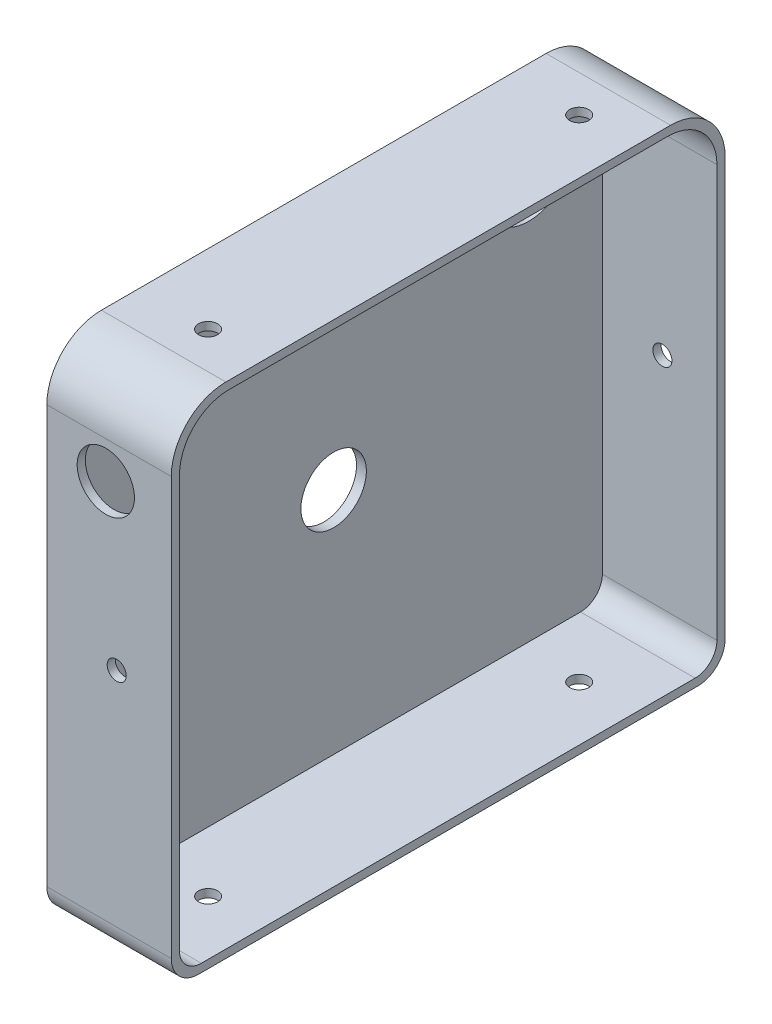
ISO-10303-21;
HEADER;
FILE_DESCRIPTION(('STEP AP214'),'2;1');
FILE_NAME('part.step','',(''),(''),'','','');
FILE_SCHEMA(('AUTOMOTIVE_DESIGN { 1 0 10303 214 1 1 1 1 }'));
ENDSEC;
DATA;
#1=APPLICATION_CONTEXT('core data for automotive mechanical design processes');
#2=APPLICATION_PROTOCOL_DEFINITION('international standard','automotive_design',2000,#1);
#3=PRODUCT_CONTEXT('',#1,'mechanical');
#4=PRODUCT('Part','Part','',(#3));
#5=PRODUCT_RELATED_PRODUCT_CATEGORY('part','',(#4));
#6=PRODUCT_DEFINITION_FORMATION('','',#4);
#7=PRODUCT_DEFINITION_CONTEXT('part definition',#1,'design');
#8=PRODUCT_DEFINITION('design','',#6,#7);
#9=PRODUCT_DEFINITION_SHAPE('','',#8);
#10=(LENGTH_UNIT() NAMED_UNIT(*) SI_UNIT(.MILLI.,.METRE.));
#11=(NAMED_UNIT(*) PLANE_ANGLE_UNIT() SI_UNIT($,.RADIAN.));
#12=(NAMED_UNIT(*) SI_UNIT($,.STERADIAN.) SOLID_ANGLE_UNIT());
#13=UNCERTAINTY_MEASURE_WITH_UNIT(LENGTH_MEASURE(1.E-05),#10,'distance_accuracy_value','');
#14=(GEOMETRIC_REPRESENTATION_CONTEXT(3) GLOBAL_UNCERTAINTY_ASSIGNED_CONTEXT((#13)) GLOBAL_UNIT_ASSIGNED_CONTEXT((#10,
#11,#12)) REPRESENTATION_CONTEXT('',''));
#15=CARTESIAN_POINT('',(0.,0.,0.));
#16=DIRECTION('',(0.,0.,1.));
#17=DIRECTION('',(1.,0.,0.));
#18=AXIS2_PLACEMENT_3D('',#15,#16,#17);
#19=CARTESIAN_POINT('',(-1.8,0.,0.));
#20=DIRECTION('',(-1.,0.,0.));
#21=DIRECTION('',(0.,0.,1.));
#22=AXIS2_PLACEMENT_3D('',#19,#20,#21);
#23=PLANE('',#22);
#24=CARTESIAN_POINT('',(-1.8,43.5,-50.75));
#25=DIRECTION('',(-1.,0.,0.));
#26=DIRECTION('',(0.,0.,1.));
#27=AXIS2_PLACEMENT_3D('',#24,#25,#26);
#28=CIRCLE('',#27,5.99999999999999);
#29=CARTESIAN_POINT('',(-1.8,43.5,-44.75));
#30=VERTEX_POINT('',#29);
#31=EDGE_CURVE('E230',#30,#30,#28,.T.);
#32=ORIENTED_EDGE('',*,*,#31,.F.);
#33=EDGE_LOOP('',(#32));
#34=FACE_BOUND('',#33,.T.);
#35=DIRECTION('',(0.,-1.,0.));
#36=VECTOR('',#35,1.);
#37=CARTESIAN_POINT('',(-1.8,91.5,-101.5));
#38=LINE('',#37,#36);
#39=CARTESIAN_POINT('',(-1.8,81.5,-101.5));
#40=VERTEX_POINT('',#39);
#41=CARTESIAN_POINT('',(-1.8,5.,-101.5));
#42=VERTEX_POINT('',#41);
#43=EDGE_CURVE('E239',#40,#42,#38,.T.);
#44=ORIENTED_EDGE('',*,*,#43,.T.);
#45=CARTESIAN_POINT('',(-1.8,5.,-96.5));
#46=DIRECTION('',(-1.,0.,0.));
#47=DIRECTION('',(0.,0.,1.));
#48=AXIS2_PLACEMENT_3D('',#45,#46,#47);
#49=CIRCLE('',#48,5.);
#50=CARTESIAN_POINT('',(-1.8,0.,-96.5));
#51=VERTEX_POINT('',#50);
#52=EDGE_CURVE('E351',#42,#51,#49,.T.);
#53=ORIENTED_EDGE('',*,*,#52,.T.);
#54=DIRECTION('',(0.,0.,1.));
#55=VECTOR('',#54,1.);
#56=CARTESIAN_POINT('',(-1.8,0.,-101.5));
#57=LINE('',#56,#55);
#58=CARTESIAN_POINT('',(-1.8,0.,-5.));
#59=VERTEX_POINT('',#58);
#60=EDGE_CURVE('E244',#51,#59,#57,.T.);
#61=ORIENTED_EDGE('',*,*,#60,.T.);
#62=CARTESIAN_POINT('',(-1.8,5.,-5.));
#63=DIRECTION('',(-1.,0.,0.));
#64=DIRECTION('',(0.,0.,1.));
#65=AXIS2_PLACEMENT_3D('',#62,#63,#64);
#66=CIRCLE('',#65,5.);
#67=CARTESIAN_POINT('',(-1.8,5.,0.));
#68=VERTEX_POINT('',#67);
#69=EDGE_CURVE('E349',#59,#68,#66,.T.);
#70=ORIENTED_EDGE('',*,*,#69,.T.);
#71=DIRECTION('',(0.,1.,0.));
#72=VECTOR('',#71,1.);
#73=CARTESIAN_POINT('',(-1.8,91.5,0.));
#74=LINE('',#73,#72);
#75=CARTESIAN_POINT('',(-1.8,81.5,0.));
#76=VERTEX_POINT('',#75);
#77=EDGE_CURVE('E247',#68,#76,#74,.T.);
#78=ORIENTED_EDGE('',*,*,#77,.T.);
#79=CARTESIAN_POINT('',(-1.8,81.5,-10.));
#80=DIRECTION('',(-1.,0.,0.));
#81=DIRECTION('',(0.,0.,1.));
#82=AXIS2_PLACEMENT_3D('',#79,#80,#81);
#83=CIRCLE('',#82,10.);
#84=CARTESIAN_POINT('',(-1.8,91.5,-10.));
#85=VERTEX_POINT('',#84);
#86=EDGE_CURVE('E314',#76,#85,#83,.T.);
#87=ORIENTED_EDGE('',*,*,#86,.T.);
#88=DIRECTION('',(0.,0.,-1.));
#89=VECTOR('',#88,1.);
#90=CARTESIAN_POINT('',(-1.8,91.5,-101.5));
#91=LINE('',#90,#89);
#92=CARTESIAN_POINT('',(-1.8,91.5,-91.5));
#93=VERTEX_POINT('',#92);
#94=EDGE_CURVE('E249',#85,#93,#91,.T.);
#95=ORIENTED_EDGE('',*,*,#94,.T.);
#96=CARTESIAN_POINT('',(-1.8,81.5,-91.5));
#97=DIRECTION('',(-1.,0.,0.));
#98=DIRECTION('',(0.,0.,1.));
#99=AXIS2_PLACEMENT_3D('',#96,#97,#98);
#100=CIRCLE('',#99,10.);
#101=EDGE_CURVE('E316',#93,#40,#100,.T.);
#102=ORIENTED_EDGE('',*,*,#101,.T.);
#103=EDGE_LOOP('',(#44,#53,#61,#70,#78,#87,#95,#102));
#104=FACE_BOUND('',#103,.T.);
#105=CARTESIAN_POINT('',(-1.8,76.5,-86.5));
#106=DIRECTION('',(-1.,0.,0.));
#107=DIRECTION('',(0.,0.,1.));
#108=AXIS2_PLACEMENT_3D('',#105,#106,#107);
#109=CIRCLE('',#108,8.24999999999999);
#110=CARTESIAN_POINT('',(-1.8,76.5,-78.25));
#111=VERTEX_POINT('',#110);
#112=EDGE_CURVE('E236',#111,#111,#109,.T.);
#113=ORIENTED_EDGE('',*,*,#112,.F.);
#114=EDGE_LOOP('',(#113));
#115=FACE_BOUND('',#114,.T.);
#116=CARTESIAN_POINT('',(-1.8,43.5,-45.75));
#117=DIRECTION('',(-1.,0.,0.));
#118=DIRECTION('',(0.,0.,1.));
#119=AXIS2_PLACEMENT_3D('',#116,#117,#118);
#120=CIRCLE('',#119,25.);
#121=CARTESIAN_POINT('',(-1.8,43.5,-20.75));
#122=VERTEX_POINT('',#121);
#123=CARTESIAN_POINT('',(-1.8,43.5,-70.75));
#124=VERTEX_POINT('',#123);
#125=EDGE_CURVE('E50',#122,#124,#120,.T.);
#126=ORIENTED_EDGE('',*,*,#125,.F.);
#127=DIRECTION('',(0.,0.,1.));
#128=VECTOR('',#127,1.);
#129=CARTESIAN_POINT('',(-1.8,43.5,-30.75));
#130=LINE('',#129,#128);
#131=CARTESIAN_POINT('',(-1.8,43.5,-30.75));
#132=VERTEX_POINT('',#131);
#133=EDGE_CURVE('E183',#132,#122,#130,.T.);
#134=ORIENTED_EDGE('',*,*,#133,.F.);
#135=CARTESIAN_POINT('',(-1.8,43.5,-50.75));
#136=DIRECTION('',(1.,0.,0.));
#137=DIRECTION('',(0.,0.,1.));
#138=AXIS2_PLACEMENT_3D('',#135,#136,#137);
#139=CIRCLE('',#138,20.);
#140=EDGE_CURVE('E186',#124,#132,#139,.T.);
#141=ORIENTED_EDGE('',*,*,#140,.F.);
#142=EDGE_LOOP('',(#126,#134,#141));
#143=FACE_BOUND('',#142,.T.);
#144=ADVANCED_FACE('F35',(#34,#104,#115,#143),#23,.T.);
#145=CARTESIAN_POINT('',(21.,0.,0.));
#146=DIRECTION('',(-1.,0.,0.));
#147=DIRECTION('',(0.,0.,1.));
#148=AXIS2_PLACEMENT_3D('',#145,#146,#147);
#149=PLANE('',#148);
#150=DIRECTION('',(0.,0.,-1.));
#151=VECTOR('',#150,1.);
#152=CARTESIAN_POINT('',(21.,0.,0.));
#153=LINE('',#152,#151);
#154=CARTESIAN_POINT('',(21.,0.,-5.));
#155=VERTEX_POINT('',#154);
#156=CARTESIAN_POINT('',(21.,0.,-96.5));
#157=VERTEX_POINT('',#156);
#158=EDGE_CURVE('E276',#155,#157,#153,.T.);
#159=ORIENTED_EDGE('',*,*,#158,.T.);
#160=CARTESIAN_POINT('',(21.,5.,-96.5));
#161=DIRECTION('',(-1.,0.,0.));
#162=DIRECTION('',(0.,0.,1.));
#163=AXIS2_PLACEMENT_3D('',#160,#161,#162);
#164=CIRCLE('',#163,5.);
#165=CARTESIAN_POINT('',(21.,5.,-101.5));
#166=VERTEX_POINT('',#165);
#167=EDGE_CURVE('E43',#157,#166,#164,.F.);
#168=ORIENTED_EDGE('',*,*,#167,.T.);
#169=DIRECTION('',(0.,1.,0.));
#170=VECTOR('',#169,1.);
#171=CARTESIAN_POINT('',(21.,0.,-101.5));
#172=LINE('',#171,#170);
#173=CARTESIAN_POINT('',(21.,81.5,-101.5));
#174=VERTEX_POINT('',#173);
#175=EDGE_CURVE('E279',#166,#174,#172,.T.);
#176=ORIENTED_EDGE('',*,*,#175,.T.);
#177=CARTESIAN_POINT('',(21.,81.5,-91.5));
#178=DIRECTION('',(-1.,0.,0.));
#179=DIRECTION('',(0.,0.,1.));
#180=AXIS2_PLACEMENT_3D('',#177,#178,#179);
#181=CIRCLE('',#180,10.);
#182=CARTESIAN_POINT('',(21.,91.5,-91.5));
#183=VERTEX_POINT('',#182);
#184=EDGE_CURVE('E323',#174,#183,#181,.F.);
#185=ORIENTED_EDGE('',*,*,#184,.T.);
#186=DIRECTION('',(0.,0.,1.));
#187=VECTOR('',#186,1.);
#188=CARTESIAN_POINT('',(21.,91.5,0.));
#189=LINE('',#188,#187);
#190=CARTESIAN_POINT('',(21.,91.5,-9.99999999999999));
#191=VERTEX_POINT('',#190);
#192=EDGE_CURVE('E281',#183,#191,#189,.T.);
#193=ORIENTED_EDGE('',*,*,#192,.T.);
#194=CARTESIAN_POINT('',(21.,81.5,-10.));
#195=DIRECTION('',(-1.,0.,0.));
#196=DIRECTION('',(0.,0.,1.));
#197=AXIS2_PLACEMENT_3D('',#194,#195,#196);
#198=CIRCLE('',#197,10.);
#199=CARTESIAN_POINT('',(21.,81.5,0.));
#200=VERTEX_POINT('',#199);
#201=EDGE_CURVE('E321',#191,#200,#198,.F.);
#202=ORIENTED_EDGE('',*,*,#201,.T.);
#203=DIRECTION('',(0.,-1.,0.));
#204=VECTOR('',#203,1.);
#205=CARTESIAN_POINT('',(21.,0.,0.));
#206=LINE('',#205,#204);
#207=CARTESIAN_POINT('',(21.,5.,0.));
#208=VERTEX_POINT('',#207);
#209=EDGE_CURVE('E265',#200,#208,#206,.T.);
#210=ORIENTED_EDGE('',*,*,#209,.T.);
#211=CARTESIAN_POINT('',(21.,5.,-5.));
#212=DIRECTION('',(-1.,0.,0.));
#213=DIRECTION('',(0.,0.,1.));
#214=AXIS2_PLACEMENT_3D('',#211,#212,#213);
#215=CIRCLE('',#214,5.);
#216=EDGE_CURVE('E358',#208,#155,#215,.F.);
#217=ORIENTED_EDGE('',*,*,#216,.T.);
#218=EDGE_LOOP('',(#159,#168,#176,#185,#193,#202,#210,#217));
#219=FACE_BOUND('',#218,.T.);
#220=DIRECTION('',(0.,0.,-1.));
#221=VECTOR('',#220,1.);
#222=CARTESIAN_POINT('',(21.,1.5,-1.5));
#223=LINE('',#222,#221);
#224=CARTESIAN_POINT('',(21.,1.5,-5.5));
#225=VERTEX_POINT('',#224);
#226=CARTESIAN_POINT('',(21.,1.5,-96.));
#227=VERTEX_POINT('',#226);
#228=EDGE_CURVE('E253',#225,#227,#223,.T.);
#229=ORIENTED_EDGE('',*,*,#228,.F.);
#230=CARTESIAN_POINT('',(21.,5.5,-5.5));
#231=DIRECTION('',(-1.,0.,0.));
#232=DIRECTION('',(0.,0.,1.));
#233=AXIS2_PLACEMENT_3D('',#230,#231,#232);
#234=CIRCLE('',#233,4.);
#235=CARTESIAN_POINT('',(21.,5.5,-1.5));
#236=VERTEX_POINT('',#235);
#237=EDGE_CURVE('E342',#225,#236,#234,.T.);
#238=ORIENTED_EDGE('',*,*,#237,.T.);
#239=DIRECTION('',(0.,-1.,0.));
#240=VECTOR('',#239,1.);
#241=CARTESIAN_POINT('',(21.,1.5,-1.5));
#242=LINE('',#241,#240);
#243=CARTESIAN_POINT('',(21.,81.,-1.5));
#244=VERTEX_POINT('',#243);
#245=EDGE_CURVE('E262',#244,#236,#242,.T.);
#246=ORIENTED_EDGE('',*,*,#245,.F.);
#247=CARTESIAN_POINT('',(21.,81.,-10.5));
#248=DIRECTION('',(-1.,0.,0.));
#249=DIRECTION('',(0.,0.,1.));
#250=AXIS2_PLACEMENT_3D('',#247,#248,#249);
#251=CIRCLE('',#250,9.);
#252=CARTESIAN_POINT('',(21.,90.,-10.5));
#253=VERTEX_POINT('',#252);
#254=EDGE_CURVE('E304',#244,#253,#251,.T.);
#255=ORIENTED_EDGE('',*,*,#254,.T.);
#256=DIRECTION('',(0.,0.,1.));
#257=VECTOR('',#256,1.);
#258=CARTESIAN_POINT('',(21.,90.,-1.5));
#259=LINE('',#258,#257);
#260=CARTESIAN_POINT('',(21.,90.,-91.));
#261=VERTEX_POINT('',#260);
#262=EDGE_CURVE('E259',#261,#253,#259,.T.);
#263=ORIENTED_EDGE('',*,*,#262,.F.);
#264=CARTESIAN_POINT('',(21.,81.,-91.));
#265=DIRECTION('',(-1.,0.,0.));
#266=DIRECTION('',(0.,0.,1.));
#267=AXIS2_PLACEMENT_3D('',#264,#265,#266);
#268=CIRCLE('',#267,9.);
#269=CARTESIAN_POINT('',(21.,81.,-100.));
#270=VERTEX_POINT('',#269);
#271=EDGE_CURVE('E306',#261,#270,#268,.T.);
#272=ORIENTED_EDGE('',*,*,#271,.T.);
#273=DIRECTION('',(0.,1.,0.));
#274=VECTOR('',#273,1.);
#275=CARTESIAN_POINT('',(21.,1.5,-100.));
#276=LINE('',#275,#274);
#277=CARTESIAN_POINT('',(21.,5.5,-100.));
#278=VERTEX_POINT('',#277);
#279=EDGE_CURVE('E256',#278,#270,#276,.T.);
#280=ORIENTED_EDGE('',*,*,#279,.F.);
#281=CARTESIAN_POINT('',(21.,5.5,-96.));
#282=DIRECTION('',(-1.,0.,0.));
#283=DIRECTION('',(0.,0.,1.));
#284=AXIS2_PLACEMENT_3D('',#281,#282,#283);
#285=CIRCLE('',#284,4.);
#286=EDGE_CURVE('E344',#278,#227,#285,.T.);
#287=ORIENTED_EDGE('',*,*,#286,.T.);
#288=EDGE_LOOP('',(#229,#238,#246,#255,#263,#272,#280,#287));
#289=FACE_BOUND('',#288,.T.);
#290=ADVANCED_FACE('F362',(#219,#289),#149,.F.);
#291=CARTESIAN_POINT('',(21.,0.,0.));
#292=DIRECTION('',(0.,0.,-1.));
#293=DIRECTION('',(-1.,0.,0.));
#294=AXIS2_PLACEMENT_3D('',#291,#292,#293);
#295=PLANE('',#294);
#296=CARTESIAN_POINT('',(9.,74.75,0.));
#297=DIRECTION('',(0.,0.,1.));
#298=DIRECTION('',(1.,0.,0.));
#299=AXIS2_PLACEMENT_3D('',#296,#297,#298);
#300=CIRCLE('',#299,5.25000000000001);
#301=CARTESIAN_POINT('',(14.25,74.75,0.));
#302=VERTEX_POINT('',#301);
#303=EDGE_CURVE('E194',#302,#302,#300,.T.);
#304=ORIENTED_EDGE('',*,*,#303,.F.);
#305=EDGE_LOOP('',(#304));
#306=FACE_BOUND('',#305,.T.);
#307=CARTESIAN_POINT('',(11.,45.75,0.));
#308=DIRECTION('',(0.,0.,1.));
#309=DIRECTION('',(1.,0.,0.));
#310=AXIS2_PLACEMENT_3D('',#307,#308,#309);
#311=CIRCLE('',#310,1.75);
#312=CARTESIAN_POINT('',(12.75,45.75,0.));
#313=VERTEX_POINT('',#312);
#314=EDGE_CURVE('E219',#313,#313,#311,.T.);
#315=ORIENTED_EDGE('',*,*,#314,.F.);
#316=EDGE_LOOP('',(#315));
#317=FACE_BOUND('',#316,.T.);
#318=ORIENTED_EDGE('',*,*,#77,.F.);
#319=DIRECTION('',(-1.,0.,0.));
#320=VECTOR('',#319,1.);
#321=CARTESIAN_POINT('',(21.,5.,0.));
#322=LINE('',#321,#320);
#323=EDGE_CURVE('E11',#68,#208,#322,.F.);
#324=ORIENTED_EDGE('',*,*,#323,.T.);
#325=ORIENTED_EDGE('',*,*,#209,.F.);
#326=DIRECTION('',(-1.,0.,0.));
#327=VECTOR('',#326,1.);
#328=CARTESIAN_POINT('',(21.,81.5,0.));
#329=LINE('',#328,#327);
#330=EDGE_CURVE('E325',#200,#76,#329,.T.);
#331=ORIENTED_EDGE('',*,*,#330,.T.);
#332=EDGE_LOOP('',(#318,#324,#325,#331));
#333=FACE_BOUND('',#332,.T.);
#334=ADVANCED_FACE('F383',(#306,#317,#333),#295,.F.);
#335=CARTESIAN_POINT('',(21.,0.,0.));
#336=DIRECTION('',(0.,1.,0.));
#337=DIRECTION('',(0.,0.,1.));
#338=AXIS2_PLACEMENT_3D('',#335,#336,#337);
#339=PLANE('',#338);
#340=CARTESIAN_POINT('',(11.,0.,-84.75));
#341=DIRECTION('',(0.,1.,0.));
#342=DIRECTION('',(0.,0.,-1.));
#343=AXIS2_PLACEMENT_3D('',#340,#341,#342);
#344=CIRCLE('',#343,1.75000000000001);
#345=CARTESIAN_POINT('',(11.,0.,-86.5));
#346=VERTEX_POINT('',#345);
#347=EDGE_CURVE('E200',#346,#346,#344,.T.);
#348=ORIENTED_EDGE('',*,*,#347,.T.);
#349=EDGE_LOOP('',(#348));
#350=FACE_BOUND('',#349,.T.);
#351=CARTESIAN_POINT('',(11.,0.,-16.75));
#352=DIRECTION('',(0.,1.,0.));
#353=DIRECTION('',(0.,0.,1.));
#354=AXIS2_PLACEMENT_3D('',#351,#352,#353);
#355=CIRCLE('',#354,1.75000000000001);
#356=CARTESIAN_POINT('',(11.,0.,-15.));
#357=VERTEX_POINT('',#356);
#358=EDGE_CURVE('E207',#357,#357,#355,.T.);
#359=ORIENTED_EDGE('',*,*,#358,.T.);
#360=EDGE_LOOP('',(#359));
#361=FACE_BOUND('',#360,.T.);
#362=ORIENTED_EDGE('',*,*,#60,.F.);
#363=DIRECTION('',(-1.,0.,0.));
#364=VECTOR('',#363,1.);
#365=CARTESIAN_POINT('',(21.,0.,-96.5));
#366=LINE('',#365,#364);
#367=EDGE_CURVE('E356',#51,#157,#366,.F.);
#368=ORIENTED_EDGE('',*,*,#367,.T.);
#369=ORIENTED_EDGE('',*,*,#158,.F.);
#370=DIRECTION('',(-1.,0.,0.));
#371=VECTOR('',#370,1.);
#372=CARTESIAN_POINT('',(21.,0.,-5.));
#373=LINE('',#372,#371);
#374=EDGE_CURVE('E353',#155,#59,#373,.T.);
#375=ORIENTED_EDGE('',*,*,#374,.T.);
#376=EDGE_LOOP('',(#362,#368,#369,#375));
#377=FACE_BOUND('',#376,.T.);
#378=ADVANCED_FACE('F378',(#350,#361,#377),#339,.F.);
#379=CARTESIAN_POINT('',(21.,0.,-101.5));
#380=DIRECTION('',(0.,0.,1.));
#381=DIRECTION('',(1.,0.,0.));
#382=AXIS2_PLACEMENT_3D('',#379,#380,#381);
#383=PLANE('',#382);
#384=CARTESIAN_POINT('',(11.,45.75,-101.5));
#385=DIRECTION('',(0.,0.,1.));
#386=DIRECTION('',(1.,0.,0.));
#387=AXIS2_PLACEMENT_3D('',#384,#385,#386);
#388=CIRCLE('',#387,1.75);
#389=CARTESIAN_POINT('',(12.75,45.75,-101.5));
#390=VERTEX_POINT('',#389);
#391=EDGE_CURVE('E220',#390,#390,#388,.T.);
#392=ORIENTED_EDGE('',*,*,#391,.T.);
#393=EDGE_LOOP('',(#392));
#394=FACE_BOUND('',#393,.T.);
#395=ORIENTED_EDGE('',*,*,#175,.F.);
#396=DIRECTION('',(-1.,0.,0.));
#397=VECTOR('',#396,1.);
#398=CARTESIAN_POINT('',(21.,5.,-101.5));
#399=LINE('',#398,#397);
#400=EDGE_CURVE('E346',#166,#42,#399,.T.);
#401=ORIENTED_EDGE('',*,*,#400,.T.);
#402=ORIENTED_EDGE('',*,*,#43,.F.);
#403=DIRECTION('',(-1.,0.,0.));
#404=VECTOR('',#403,1.);
#405=CARTESIAN_POINT('',(21.,81.5,-101.5));
#406=LINE('',#405,#404);
#407=EDGE_CURVE('E318',#40,#174,#406,.F.);
#408=ORIENTED_EDGE('',*,*,#407,.T.);
#409=EDGE_LOOP('',(#395,#401,#402,#408));
#410=FACE_BOUND('',#409,.T.);
#411=ADVANCED_FACE('F369',(#394,#410),#383,.F.);
#412=CARTESIAN_POINT('',(21.,91.5,0.));
#413=DIRECTION('',(0.,-1.,0.));
#414=DIRECTION('',(0.,0.,-1.));
#415=AXIS2_PLACEMENT_3D('',#412,#413,#414);
#416=PLANE('',#415);
#417=CARTESIAN_POINT('',(11.,91.5,-84.75));
#418=DIRECTION('',(0.,1.,0.));
#419=DIRECTION('',(0.,0.,-1.));
#420=AXIS2_PLACEMENT_3D('',#417,#418,#419);
#421=CIRCLE('',#420,1.75000000000001);
#422=CARTESIAN_POINT('',(11.,91.5,-86.5));
#423=VERTEX_POINT('',#422);
#424=EDGE_CURVE('E204',#423,#423,#421,.T.);
#425=ORIENTED_EDGE('',*,*,#424,.F.);
#426=EDGE_LOOP('',(#425));
#427=FACE_BOUND('',#426,.T.);
#428=CARTESIAN_POINT('',(11.,91.5,-16.75));
#429=DIRECTION('',(0.,1.,0.));
#430=DIRECTION('',(0.,0.,1.));
#431=AXIS2_PLACEMENT_3D('',#428,#429,#430);
#432=CIRCLE('',#431,1.75000000000001);
#433=CARTESIAN_POINT('',(11.,91.5,-15.));
#434=VERTEX_POINT('',#433);
#435=EDGE_CURVE('E198',#434,#434,#432,.T.);
#436=ORIENTED_EDGE('',*,*,#435,.F.);
#437=EDGE_LOOP('',(#436));
#438=FACE_BOUND('',#437,.T.);
#439=ORIENTED_EDGE('',*,*,#192,.F.);
#440=DIRECTION('',(-1.,0.,0.));
#441=VECTOR('',#440,1.);
#442=CARTESIAN_POINT('',(21.,91.5,-91.5));
#443=LINE('',#442,#441);
#444=EDGE_CURVE('E311',#183,#93,#443,.T.);
#445=ORIENTED_EDGE('',*,*,#444,.T.);
#446=ORIENTED_EDGE('',*,*,#94,.F.);
#447=DIRECTION('',(-1.,0.,0.));
#448=VECTOR('',#447,1.);
#449=CARTESIAN_POINT('',(21.,91.5,-10.));
#450=LINE('',#449,#448);
#451=EDGE_CURVE('E309',#85,#191,#450,.F.);
#452=ORIENTED_EDGE('',*,*,#451,.T.);
#453=EDGE_LOOP('',(#439,#445,#446,#452));
#454=FACE_BOUND('',#453,.T.);
#455=ADVANCED_FACE('F392',(#427,#438,#454),#416,.F.);
#456=CARTESIAN_POINT('',(21.,1.5,-1.5));
#457=DIRECTION('',(0.,1.,0.));
#458=DIRECTION('',(0.,0.,1.));
#459=AXIS2_PLACEMENT_3D('',#456,#457,#458);
#460=PLANE('',#459);
#461=CARTESIAN_POINT('',(11.,1.5,-84.75));
#462=DIRECTION('',(0.,1.,0.));
#463=DIRECTION('',(0.,0.,1.));
#464=AXIS2_PLACEMENT_3D('',#461,#462,#463);
#465=CIRCLE('',#464,1.75000000000001);
#466=CARTESIAN_POINT('',(11.,1.5,-83.));
#467=VERTEX_POINT('',#466);
#468=EDGE_CURVE('E216',#467,#467,#465,.T.);
#469=ORIENTED_EDGE('',*,*,#468,.F.);
#470=EDGE_LOOP('',(#469));
#471=FACE_BOUND('',#470,.T.);
#472=CARTESIAN_POINT('',(11.,1.5,-16.75));
#473=DIRECTION('',(0.,1.,0.));
#474=DIRECTION('',(0.,0.,1.));
#475=AXIS2_PLACEMENT_3D('',#472,#473,#474);
#476=CIRCLE('',#475,1.75000000000001);
#477=CARTESIAN_POINT('',(11.,1.5,-15.));
#478=VERTEX_POINT('',#477);
#479=EDGE_CURVE('E212',#478,#478,#476,.T.);
#480=ORIENTED_EDGE('',*,*,#479,.F.);
#481=EDGE_LOOP('',(#480));
#482=FACE_BOUND('',#481,.T.);
#483=DIRECTION('',(0.,0.,-1.));
#484=VECTOR('',#483,1.);
#485=CARTESIAN_POINT('',(0.,1.5,-1.5));
#486=LINE('',#485,#484);
#487=CARTESIAN_POINT('',(0.,1.5,-5.5));
#488=VERTEX_POINT('',#487);
#489=CARTESIAN_POINT('',(0.,1.5,-96.));
#490=VERTEX_POINT('',#489);
#491=EDGE_CURVE('E252',#488,#490,#486,.T.);
#492=ORIENTED_EDGE('',*,*,#491,.F.);
#493=DIRECTION('',(-1.,0.,0.));
#494=VECTOR('',#493,1.);
#495=CARTESIAN_POINT('',(21.,1.5,-5.5));
#496=LINE('',#495,#494);
#497=EDGE_CURVE('E338',#488,#225,#496,.F.);
#498=ORIENTED_EDGE('',*,*,#497,.T.);
#499=ORIENTED_EDGE('',*,*,#228,.T.);
#500=DIRECTION('',(-1.,0.,0.));
#501=VECTOR('',#500,1.);
#502=CARTESIAN_POINT('',(0.,1.5,-96.));
#503=LINE('',#502,#501);
#504=EDGE_CURVE('E335',#227,#490,#503,.T.);
#505=ORIENTED_EDGE('',*,*,#504,.T.);
#506=EDGE_LOOP('',(#492,#498,#499,#505));
#507=FACE_BOUND('',#506,.T.);
#508=ADVANCED_FACE('F435',(#471,#482,#507),#460,.T.);
#509=CARTESIAN_POINT('',(21.,1.5,-100.));
#510=DIRECTION('',(0.,0.,1.));
#511=DIRECTION('',(1.,0.,0.));
#512=AXIS2_PLACEMENT_3D('',#509,#510,#511);
#513=PLANE('',#512);
#514=CARTESIAN_POINT('',(11.,45.75,-100.));
#515=DIRECTION('',(0.,0.,1.));
#516=DIRECTION('',(1.,0.,0.));
#517=AXIS2_PLACEMENT_3D('',#514,#515,#516);
#518=CIRCLE('',#517,1.75);
#519=CARTESIAN_POINT('',(12.75,45.75,-100.));
#520=VERTEX_POINT('',#519);
#521=EDGE_CURVE('E226',#520,#520,#518,.T.);
#522=ORIENTED_EDGE('',*,*,#521,.F.);
#523=EDGE_LOOP('',(#522));
#524=FACE_BOUND('',#523,.T.);
#525=DIRECTION('',(0.,1.,0.));
#526=VECTOR('',#525,1.);
#527=CARTESIAN_POINT('',(0.,1.5,-100.));
#528=LINE('',#527,#526);
#529=CARTESIAN_POINT('',(0.,5.5,-100.));
#530=VERTEX_POINT('',#529);
#531=CARTESIAN_POINT('',(0.,81.,-100.));
#532=VERTEX_POINT('',#531);
#533=EDGE_CURVE('E268',#530,#532,#528,.T.);
#534=ORIENTED_EDGE('',*,*,#533,.F.);
#535=DIRECTION('',(-1.,0.,0.));
#536=VECTOR('',#535,1.);
#537=CARTESIAN_POINT('',(21.,5.5,-100.));
#538=LINE('',#537,#536);
#539=EDGE_CURVE('E340',#530,#278,#538,.F.);
#540=ORIENTED_EDGE('',*,*,#539,.T.);
#541=ORIENTED_EDGE('',*,*,#279,.T.);
#542=DIRECTION('',(-1.,0.,0.));
#543=VECTOR('',#542,1.);
#544=CARTESIAN_POINT('',(0.,81.,-100.));
#545=LINE('',#544,#543);
#546=EDGE_CURVE('E301',#270,#532,#545,.T.);
#547=ORIENTED_EDGE('',*,*,#546,.T.);
#548=EDGE_LOOP('',(#534,#540,#541,#547));
#549=FACE_BOUND('',#548,.T.);
#550=ADVANCED_FACE('F431',(#524,#549),#513,.T.);
#551=CARTESIAN_POINT('',(21.,90.,-1.5));
#552=DIRECTION('',(0.,-1.,0.));
#553=DIRECTION('',(0.,0.,-1.));
#554=AXIS2_PLACEMENT_3D('',#551,#552,#553);
#555=PLANE('',#554);
#556=CARTESIAN_POINT('',(11.,90.,-84.75));
#557=DIRECTION('',(0.,-1.,0.));
#558=DIRECTION('',(0.,0.,-1.));
#559=AXIS2_PLACEMENT_3D('',#556,#557,#558);
#560=CIRCLE('',#559,1.75000000000001);
#561=CARTESIAN_POINT('',(11.,90.,-86.5));
#562=VERTEX_POINT('',#561);
#563=EDGE_CURVE('E215',#562,#562,#560,.T.);
#564=ORIENTED_EDGE('',*,*,#563,.F.);
#565=EDGE_LOOP('',(#564));
#566=FACE_BOUND('',#565,.T.);
#567=CARTESIAN_POINT('',(11.,90.,-16.75));
#568=DIRECTION('',(0.,-1.,0.));
#569=DIRECTION('',(0.,0.,-1.));
#570=AXIS2_PLACEMENT_3D('',#567,#568,#569);
#571=CIRCLE('',#570,1.75000000000001);
#572=CARTESIAN_POINT('',(11.,90.,-18.5));
#573=VERTEX_POINT('',#572);
#574=EDGE_CURVE('E203',#573,#573,#571,.T.);
#575=ORIENTED_EDGE('',*,*,#574,.F.);
#576=EDGE_LOOP('',(#575));
#577=FACE_BOUND('',#576,.T.);
#578=ORIENTED_EDGE('',*,*,#262,.T.);
#579=DIRECTION('',(-1.,0.,0.));
#580=VECTOR('',#579,1.);
#581=CARTESIAN_POINT('',(0.,90.,-10.5));
#582=LINE('',#581,#580);
#583=CARTESIAN_POINT('',(0.,90.,-10.5));
#584=VERTEX_POINT('',#583);
#585=EDGE_CURVE('E292',#253,#584,#582,.T.);
#586=ORIENTED_EDGE('',*,*,#585,.T.);
#587=DIRECTION('',(0.,0.,1.));
#588=VECTOR('',#587,1.);
#589=CARTESIAN_POINT('',(0.,90.,-1.5));
#590=LINE('',#589,#588);
#591=CARTESIAN_POINT('',(0.,90.,-91.));
#592=VERTEX_POINT('',#591);
#593=EDGE_CURVE('E270',#592,#584,#590,.T.);
#594=ORIENTED_EDGE('',*,*,#593,.F.);
#595=DIRECTION('',(-1.,0.,0.));
#596=VECTOR('',#595,1.);
#597=CARTESIAN_POINT('',(21.,90.,-91.));
#598=LINE('',#597,#596);
#599=EDGE_CURVE('E284',#592,#261,#598,.F.);
#600=ORIENTED_EDGE('',*,*,#599,.T.);
#601=EDGE_LOOP('',(#578,#586,#594,#600));
#602=FACE_BOUND('',#601,.T.);
#603=ADVANCED_FACE('F427',(#566,#577,#602),#555,.T.);
#604=CARTESIAN_POINT('',(21.,1.5,-1.5));
#605=DIRECTION('',(0.,0.,-1.));
#606=DIRECTION('',(0.,1.,0.));
#607=AXIS2_PLACEMENT_3D('',#604,#605,#606);
#608=PLANE('',#607);
#609=CARTESIAN_POINT('',(9.,74.75,-1.5));
#610=DIRECTION('',(0.,0.,-1.));
#611=DIRECTION('',(0.,1.,0.));
#612=AXIS2_PLACEMENT_3D('',#609,#610,#611);
#613=CIRCLE('',#612,5.25000000000001);
#614=CARTESIAN_POINT('',(9.,80.,-1.5));
#615=VERTEX_POINT('',#614);
#616=EDGE_CURVE('E189',#615,#615,#613,.F.);
#617=ORIENTED_EDGE('',*,*,#616,.T.);
#618=EDGE_LOOP('',(#617));
#619=FACE_BOUND('',#618,.T.);
#620=CARTESIAN_POINT('',(11.,45.75,-1.5));
#621=DIRECTION('',(0.,0.,-1.));
#622=DIRECTION('',(0.,1.,0.));
#623=AXIS2_PLACEMENT_3D('',#620,#621,#622);
#624=CIRCLE('',#623,1.75);
#625=CARTESIAN_POINT('',(12.75,45.75,-1.49999999999999));
#626=VERTEX_POINT('',#625);
#627=EDGE_CURVE('E223',#626,#626,#624,.T.);
#628=ORIENTED_EDGE('',*,*,#627,.F.);
#629=EDGE_LOOP('',(#628));
#630=FACE_BOUND('',#629,.T.);
#631=ORIENTED_EDGE('',*,*,#245,.T.);
#632=DIRECTION('',(-1.,0.,0.));
#633=VECTOR('',#632,1.);
#634=CARTESIAN_POINT('',(0.,5.5,-1.5));
#635=LINE('',#634,#633);
#636=CARTESIAN_POINT('',(0.,5.5,-1.5));
#637=VERTEX_POINT('',#636);
#638=EDGE_CURVE('E328',#236,#637,#635,.T.);
#639=ORIENTED_EDGE('',*,*,#638,.T.);
#640=DIRECTION('',(0.,-1.,0.));
#641=VECTOR('',#640,1.);
#642=CARTESIAN_POINT('',(0.,1.5,-1.5));
#643=LINE('',#642,#641);
#644=CARTESIAN_POINT('',(0.,81.,-1.5));
#645=VERTEX_POINT('',#644);
#646=EDGE_CURVE('E257',#645,#637,#643,.T.);
#647=ORIENTED_EDGE('',*,*,#646,.F.);
#648=DIRECTION('',(-1.,0.,0.));
#649=VECTOR('',#648,1.);
#650=CARTESIAN_POINT('',(21.,81.,-1.5));
#651=LINE('',#650,#649);
#652=EDGE_CURVE('E299',#645,#244,#651,.F.);
#653=ORIENTED_EDGE('',*,*,#652,.T.);
#654=EDGE_LOOP('',(#631,#639,#647,#653));
#655=FACE_BOUND('',#654,.T.);
#656=ADVANCED_FACE('F423',(#619,#630,#655),#608,.T.);
#657=CARTESIAN_POINT('',(0.,0.,0.));
#658=DIRECTION('',(-1.,0.,0.));
#659=DIRECTION('',(0.,0.,1.));
#660=AXIS2_PLACEMENT_3D('',#657,#658,#659);
#661=PLANE('',#660);
#662=CARTESIAN_POINT('',(0.,43.5,-50.75));
#663=DIRECTION('',(-1.,0.,0.));
#664=DIRECTION('',(0.,0.,1.));
#665=AXIS2_PLACEMENT_3D('',#662,#663,#664);
#666=CIRCLE('',#665,5.99999999999999);
#667=CARTESIAN_POINT('',(0.,43.5,-44.75));
#668=VERTEX_POINT('',#667);
#669=EDGE_CURVE('E229',#668,#668,#666,.T.);
#670=ORIENTED_EDGE('',*,*,#669,.T.);
#671=EDGE_LOOP('',(#670));
#672=FACE_BOUND('',#671,.T.);
#673=CARTESIAN_POINT('',(0.,76.5,-86.5));
#674=DIRECTION('',(-1.,0.,0.));
#675=DIRECTION('',(0.,0.,1.));
#676=AXIS2_PLACEMENT_3D('',#673,#674,#675);
#677=CIRCLE('',#676,8.24999999999999);
#678=CARTESIAN_POINT('',(0.,76.5,-78.25));
#679=VERTEX_POINT('',#678);
#680=EDGE_CURVE('E233',#679,#679,#677,.T.);
#681=ORIENTED_EDGE('',*,*,#680,.T.);
#682=EDGE_LOOP('',(#681));
#683=FACE_BOUND('',#682,.T.);
#684=ORIENTED_EDGE('',*,*,#646,.T.);
#685=CARTESIAN_POINT('',(0.,5.5,-5.5));
#686=DIRECTION('',(-1.,0.,0.));
#687=DIRECTION('',(0.,0.,1.));
#688=AXIS2_PLACEMENT_3D('',#685,#686,#687);
#689=CIRCLE('',#688,4.);
#690=EDGE_CURVE('E333',#637,#488,#689,.F.);
#691=ORIENTED_EDGE('',*,*,#690,.T.);
#692=ORIENTED_EDGE('',*,*,#491,.T.);
#693=CARTESIAN_POINT('',(0.,5.5,-96.));
#694=DIRECTION('',(-1.,0.,0.));
#695=DIRECTION('',(0.,0.,1.));
#696=AXIS2_PLACEMENT_3D('',#693,#694,#695);
#697=CIRCLE('',#696,4.);
#698=EDGE_CURVE('E331',#490,#530,#697,.F.);
#699=ORIENTED_EDGE('',*,*,#698,.T.);
#700=ORIENTED_EDGE('',*,*,#533,.T.);
#701=CARTESIAN_POINT('',(0.,81.,-91.));
#702=DIRECTION('',(-1.,0.,0.));
#703=DIRECTION('',(0.,0.,1.));
#704=AXIS2_PLACEMENT_3D('',#701,#702,#703);
#705=CIRCLE('',#704,9.);
#706=EDGE_CURVE('E295',#532,#592,#705,.F.);
#707=ORIENTED_EDGE('',*,*,#706,.T.);
#708=ORIENTED_EDGE('',*,*,#593,.T.);
#709=CARTESIAN_POINT('',(0.,81.,-10.5));
#710=DIRECTION('',(-1.,0.,0.));
#711=DIRECTION('',(0.,0.,1.));
#712=AXIS2_PLACEMENT_3D('',#709,#710,#711);
#713=CIRCLE('',#712,9.);
#714=EDGE_CURVE('E297',#584,#645,#713,.F.);
#715=ORIENTED_EDGE('',*,*,#714,.T.);
#716=EDGE_LOOP('',(#684,#691,#692,#699,#700,#707,#708,#715));
#717=FACE_BOUND('',#716,.T.);
#718=ADVANCED_FACE('F420',(#672,#683,#717),#661,.F.);
#719=CARTESIAN_POINT('',(-1.8,76.5,-86.5));
#720=DIRECTION('',(1.,0.,0.));
#721=DIRECTION('',(0.,0.,-1.));
#722=AXIS2_PLACEMENT_3D('',#719,#720,#721);
#723=CYLINDRICAL_SURFACE('',#722,8.24999999999999);
#724=ORIENTED_EDGE('',*,*,#112,.T.);
#725=EDGE_LOOP('',(#724));
#726=FACE_BOUND('',#725,.T.);
#727=ORIENTED_EDGE('',*,*,#680,.F.);
#728=EDGE_LOOP('',(#727));
#729=FACE_BOUND('',#728,.T.);
#730=ADVANCED_FACE('F418',(#726,#729),#723,.F.);
#731=CARTESIAN_POINT('',(-1.8,43.5,-50.75));
#732=DIRECTION('',(1.,0.,0.));
#733=DIRECTION('',(0.,0.,-1.));
#734=AXIS2_PLACEMENT_3D('',#731,#732,#733);
#735=CYLINDRICAL_SURFACE('',#734,5.99999999999999);
#736=ORIENTED_EDGE('',*,*,#31,.T.);
#737=EDGE_LOOP('',(#736));
#738=FACE_BOUND('',#737,.T.);
#739=ORIENTED_EDGE('',*,*,#669,.F.);
#740=EDGE_LOOP('',(#739));
#741=FACE_BOUND('',#740,.T.);
#742=ADVANCED_FACE('F522',(#738,#741),#735,.F.);
#743=CARTESIAN_POINT('',(11.,45.75,-101.5));
#744=DIRECTION('',(0.,0.,1.));
#745=DIRECTION('',(1.,0.,0.));
#746=AXIS2_PLACEMENT_3D('',#743,#744,#745);
#747=CYLINDRICAL_SURFACE('',#746,1.75);
#748=CARTESIAN_POINT('',(12.75,45.75,-1.49999999999999));
#749=CARTESIAN_POINT('',(12.75,45.75,-1.48437499999999));
#750=CARTESIAN_POINT('',(12.75,45.75,-1.46874999999999));
#751=CARTESIAN_POINT('',(12.75,45.75,-1.43749999999999));
#752=CARTESIAN_POINT('',(12.75,45.75,-1.42187499999998));
#753=CARTESIAN_POINT('',(12.75,45.75,-1.39062499999999));
#754=CARTESIAN_POINT('',(12.75,45.75,-1.37499999999999));
#755=CARTESIAN_POINT('',(12.75,45.75,-1.34375));
#756=CARTESIAN_POINT('',(12.75,45.75,-1.32812499999999));
#757=CARTESIAN_POINT('',(12.75,45.75,-1.29687499999999));
#758=CARTESIAN_POINT('',(12.75,45.75,-1.28124999999999));
#759=CARTESIAN_POINT('',(12.75,45.75,-1.24999999999999));
#760=CARTESIAN_POINT('',(12.75,45.75,-1.23437499999999));
#761=CARTESIAN_POINT('',(12.75,45.75,-1.20312499999999));
#762=CARTESIAN_POINT('',(12.75,45.75,-1.18749999999999));
#763=CARTESIAN_POINT('',(12.75,45.75,-1.15624999999999));
#764=CARTESIAN_POINT('',(12.75,45.75,-1.140625));
#765=CARTESIAN_POINT('',(12.75,45.75,-1.109375));
#766=CARTESIAN_POINT('',(12.75,45.75,-1.09375));
#767=CARTESIAN_POINT('',(12.75,45.75,-1.0625));
#768=CARTESIAN_POINT('',(12.75,45.75,-1.046875));
#769=CARTESIAN_POINT('',(12.75,45.75,-1.015625));
#770=CARTESIAN_POINT('',(12.75,45.75,-0.999999999999996));
#771=CARTESIAN_POINT('',(12.75,45.75,-0.968749999999995));
#772=CARTESIAN_POINT('',(12.75,45.75,-0.953124999999994));
#773=CARTESIAN_POINT('',(12.75,45.75,-0.921874999999993));
#774=CARTESIAN_POINT('',(12.75,45.75,-0.906249999999993));
#775=CARTESIAN_POINT('',(12.75,45.75,-0.874999999999996));
#776=CARTESIAN_POINT('',(12.75,45.75,-0.859375));
#777=CARTESIAN_POINT('',(12.75,45.75,-0.828125000000004));
#778=CARTESIAN_POINT('',(12.75,45.75,-0.812500000000003));
#779=CARTESIAN_POINT('',(12.75,45.75,-0.781250000000002));
#780=CARTESIAN_POINT('',(12.75,45.75,-0.765625000000001));
#781=CARTESIAN_POINT('',(12.75,45.75,-0.734375));
#782=CARTESIAN_POINT('',(12.75,45.75,-0.718749999999999));
#783=CARTESIAN_POINT('',(12.75,45.75,-0.687499999999998));
#784=CARTESIAN_POINT('',(12.75,45.75,-0.671874999999998));
#785=CARTESIAN_POINT('',(12.75,45.75,-0.640625000000001));
#786=CARTESIAN_POINT('',(12.75,45.75,-0.625000000000005));
#787=CARTESIAN_POINT('',(12.75,45.75,-0.593750000000009));
#788=CARTESIAN_POINT('',(12.75,45.75,-0.578125000000008));
#789=CARTESIAN_POINT('',(12.75,45.75,-0.546875000000007));
#790=CARTESIAN_POINT('',(12.75,45.75,-0.531250000000006));
#791=CARTESIAN_POINT('',(12.75,45.75,-0.500000000000005));
#792=CARTESIAN_POINT('',(12.75,45.75,-0.484375000000004));
#793=CARTESIAN_POINT('',(12.75,45.75,-0.453125000000003));
#794=CARTESIAN_POINT('',(12.75,45.75,-0.437500000000003));
#795=CARTESIAN_POINT('',(12.75,45.75,-0.406250000000001));
#796=CARTESIAN_POINT('',(12.75,45.75,-0.390625000000001));
#797=CARTESIAN_POINT('',(12.75,45.75,-0.359375000000004));
#798=CARTESIAN_POINT('',(12.75,45.75,-0.343750000000008));
#799=CARTESIAN_POINT('',(12.75,45.75,-0.312500000000012));
#800=CARTESIAN_POINT('',(12.75,45.75,-0.296875000000011));
#801=CARTESIAN_POINT('',(12.75,45.75,-0.26562500000001));
#802=CARTESIAN_POINT('',(12.75,45.75,-0.250000000000009));
#803=CARTESIAN_POINT('',(12.75,45.75,-0.218750000000008));
#804=CARTESIAN_POINT('',(12.75,45.75,-0.203125000000008));
#805=CARTESIAN_POINT('',(12.75,45.75,-0.171875000000007));
#806=CARTESIAN_POINT('',(12.75,45.75,-0.156250000000006));
#807=CARTESIAN_POINT('',(12.75,45.75,-0.125000000000009));
#808=CARTESIAN_POINT('',(12.75,45.75,-0.109375000000013));
#809=CARTESIAN_POINT('',(12.75,45.75,-0.0781250000000168));
#810=CARTESIAN_POINT('',(12.75,45.75,-0.0625000000000163));
#811=CARTESIAN_POINT('',(12.75,45.75,-0.0312500000000151));
#812=CARTESIAN_POINT('',(12.75,45.75,-0.0156250000000145));
#813=CARTESIAN_POINT('',(12.75,45.75,0.));
#814=B_SPLINE_CURVE_WITH_KNOTS('',3,(#748,#749,#750,#751,#752,#753,#754,#755,#756,#757,#758,
#759,#760,#761,#762,#763,#764,#765,#766,#767,#768,#769,#770,#771,#772,#773,#774,#775,#776,#777,
#778,#779,#780,#781,#782,#783,#784,#785,#786,#787,#788,#789,#790,#791,#792,#793,#794,#795,#796,
#797,#798,#799,#800,#801,#802,#803,#804,#805,#806,#807,#808,#809,#810,#811,#812,#813),
.UNSPECIFIED.,.F.,.F.,(4,2,2,2,2,2,2,2,2,2,2,2,2,2,2,2,2,2,2,2,2,2,2,2,2,2,2,2,2,2,2,2,4),(0.,
0.0468750000000018,0.0937500000000036,0.140624999999991,0.187499999999993,0.234374999999995,
0.281249999999997,0.328124999999999,0.374999999999986,0.421874999999988,0.46874999999999,
0.515624999999992,0.562499999999994,0.609374999999995,0.656249999999983,0.703124999999985,
0.749999999999987,0.796874999999989,0.84374999999999,0.890624999999978,0.93749999999998,
0.984374999999982,1.03124999999998,1.07812499999999,1.12499999999999,1.17187499999998,
1.21874999999998,1.26562499999998,1.31249999999998,1.35937499999998,1.40624999999997,
1.45312499999997,1.49999999999997),.UNSPECIFIED.);
#815=EDGE_CURVE('BSEAM520',#626,#313,#814,.T.);
#816=ORIENTED_EDGE('',*,*,#627,.T.);
#817=ORIENTED_EDGE('',*,*,#314,.T.);
#818=ORIENTED_EDGE('',*,*,#815,.T.);
#819=ORIENTED_EDGE('',*,*,#815,.F.);
#820=EDGE_LOOP('',(#816,#818,#817,#819));
#821=FACE_BOUND('',#820,.T.);
#822=ADVANCED_FACE('F520',(#821),#747,.F.);
#823=CARTESIAN_POINT('',(12.75,45.75,-100.));
#824=CARTESIAN_POINT('',(12.75,45.75,-100.015625));
#825=CARTESIAN_POINT('',(12.75,45.75,-100.03125));
#826=CARTESIAN_POINT('',(12.75,45.75,-100.0625));
#827=CARTESIAN_POINT('',(12.75,45.75,-100.078125));
#828=CARTESIAN_POINT('',(12.75,45.75,-100.109375));
#829=CARTESIAN_POINT('',(12.75,45.75,-100.125));
#830=CARTESIAN_POINT('',(12.75,45.75,-100.15625));
#831=CARTESIAN_POINT('',(12.75,45.75,-100.171875));
#832=CARTESIAN_POINT('',(12.75,45.75,-100.203125));
#833=CARTESIAN_POINT('',(12.75,45.75,-100.21875));
#834=CARTESIAN_POINT('',(12.75,45.75,-100.25));
#835=CARTESIAN_POINT('',(12.75,45.75,-100.265625));
#836=CARTESIAN_POINT('',(12.75,45.75,-100.296875));
#837=CARTESIAN_POINT('',(12.75,45.75,-100.3125));
#838=CARTESIAN_POINT('',(12.75,45.75,-100.34375));
#839=CARTESIAN_POINT('',(12.75,45.75,-100.359375));
#840=CARTESIAN_POINT('',(12.75,45.75,-100.390625));
#841=CARTESIAN_POINT('',(12.75,45.75,-100.40625));
#842=CARTESIAN_POINT('',(12.75,45.75,-100.4375));
#843=CARTESIAN_POINT('',(12.75,45.75,-100.453125));
#844=CARTESIAN_POINT('',(12.75,45.75,-100.484375));
#845=CARTESIAN_POINT('',(12.75,45.75,-100.5));
#846=CARTESIAN_POINT('',(12.75,45.75,-100.53125));
#847=CARTESIAN_POINT('',(12.75,45.75,-100.546875));
#848=CARTESIAN_POINT('',(12.75,45.75,-100.578125));
#849=CARTESIAN_POINT('',(12.75,45.75,-100.59375));
#850=CARTESIAN_POINT('',(12.75,45.75,-100.625));
#851=CARTESIAN_POINT('',(12.75,45.75,-100.640625));
#852=CARTESIAN_POINT('',(12.75,45.75,-100.671875));
#853=CARTESIAN_POINT('',(12.75,45.75,-100.6875));
#854=CARTESIAN_POINT('',(12.75,45.75,-100.71875));
#855=CARTESIAN_POINT('',(12.75,45.75,-100.734375));
#856=CARTESIAN_POINT('',(12.75,45.75,-100.765625));
#857=CARTESIAN_POINT('',(12.75,45.75,-100.78125));
#858=CARTESIAN_POINT('',(12.75,45.75,-100.8125));
#859=CARTESIAN_POINT('',(12.75,45.75,-100.828125));
#860=CARTESIAN_POINT('',(12.75,45.75,-100.859375));
#861=CARTESIAN_POINT('',(12.75,45.75,-100.875));
#862=CARTESIAN_POINT('',(12.75,45.75,-100.90625));
#863=CARTESIAN_POINT('',(12.75,45.75,-100.921875));
#864=CARTESIAN_POINT('',(12.75,45.75,-100.953125));
#865=CARTESIAN_POINT('',(12.75,45.75,-100.96875));
#866=CARTESIAN_POINT('',(12.75,45.75,-101.));
#867=CARTESIAN_POINT('',(12.75,45.75,-101.015625));
#868=CARTESIAN_POINT('',(12.75,45.75,-101.046875));
#869=CARTESIAN_POINT('',(12.75,45.75,-101.0625));
#870=CARTESIAN_POINT('',(12.75,45.75,-101.09375));
#871=CARTESIAN_POINT('',(12.75,45.75,-101.109375));
#872=CARTESIAN_POINT('',(12.75,45.75,-101.140625));
#873=CARTESIAN_POINT('',(12.75,45.75,-101.15625));
#874=CARTESIAN_POINT('',(12.75,45.75,-101.1875));
#875=CARTESIAN_POINT('',(12.75,45.75,-101.203125));
#876=CARTESIAN_POINT('',(12.75,45.75,-101.234375));
#877=CARTESIAN_POINT('',(12.75,45.75,-101.25));
#878=CARTESIAN_POINT('',(12.75,45.75,-101.28125));
#879=CARTESIAN_POINT('',(12.75,45.75,-101.296875));
#880=CARTESIAN_POINT('',(12.75,45.75,-101.328125));
#881=CARTESIAN_POINT('',(12.75,45.75,-101.34375));
#882=CARTESIAN_POINT('',(12.75,45.75,-101.375));
#883=CARTESIAN_POINT('',(12.75,45.75,-101.390625));
#884=CARTESIAN_POINT('',(12.75,45.75,-101.421875));
#885=CARTESIAN_POINT('',(12.75,45.75,-101.4375));
#886=CARTESIAN_POINT('',(12.75,45.75,-101.46875));
#887=CARTESIAN_POINT('',(12.75,45.75,-101.484375));
#888=CARTESIAN_POINT('',(12.75,45.75,-101.5));
#889=B_SPLINE_CURVE_WITH_KNOTS('',3,(#823,#824,#825,#826,#827,#828,#829,#830,#831,#832,#833,
#834,#835,#836,#837,#838,#839,#840,#841,#842,#843,#844,#845,#846,#847,#848,#849,#850,#851,#852,
#853,#854,#855,#856,#857,#858,#859,#860,#861,#862,#863,#864,#865,#866,#867,#868,#869,#870,#871,
#872,#873,#874,#875,#876,#877,#878,#879,#880,#881,#882,#883,#884,#885,#886,#887,#888),
.UNSPECIFIED.,.F.,.F.,(4,2,2,2,2,2,2,2,2,2,2,2,2,2,2,2,2,2,2,2,2,2,2,2,2,2,2,2,2,2,2,2,4),(0.,
0.0468749999999879,0.0937499999999897,0.140624999999991,0.187499999999993,0.234374999999995,
0.281249999999997,0.328124999999999,0.375,0.421874999999988,0.46874999999999,0.515624999999992,
0.562499999999994,0.609374999999995,0.656249999999997,0.703124999999999,0.750000000000001,
0.796874999999989,0.84374999999999,0.890624999999992,0.937499999999994,0.984374999999996,
1.03125,1.078125,1.125,1.17187499999999,1.21874999999999,1.26562499999999,1.31249999999999,
1.359375,1.40625,1.453125,1.49999999999999),.UNSPECIFIED.);
#890=EDGE_CURVE('BSEAM518',#520,#390,#889,.T.);
#891=ORIENTED_EDGE('',*,*,#521,.T.);
#892=ORIENTED_EDGE('',*,*,#391,.F.);
#893=ORIENTED_EDGE('',*,*,#890,.T.);
#894=ORIENTED_EDGE('',*,*,#890,.F.);
#895=EDGE_LOOP('',(#891,#893,#892,#894));
#896=FACE_BOUND('',#895,.T.);
#897=ADVANCED_FACE('F518',(#896),#747,.F.);
#898=CARTESIAN_POINT('',(11.,0.,-16.75));
#899=DIRECTION('',(0.,1.,0.));
#900=DIRECTION('',(0.,0.,1.));
#901=AXIS2_PLACEMENT_3D('',#898,#899,#900);
#902=CYLINDRICAL_SURFACE('',#901,1.75000000000001);
#903=ORIENTED_EDGE('',*,*,#574,.T.);
#904=EDGE_LOOP('',(#903));
#905=FACE_BOUND('',#904,.T.);
#906=ORIENTED_EDGE('',*,*,#435,.T.);
#907=EDGE_LOOP('',(#906));
#908=FACE_BOUND('',#907,.T.);
#909=ADVANCED_FACE('F514',(#905,#908),#902,.F.);
#910=CARTESIAN_POINT('',(11.,0.,-84.75));
#911=DIRECTION('',(0.,1.,0.));
#912=DIRECTION('',(0.,0.,1.));
#913=AXIS2_PLACEMENT_3D('',#910,#911,#912);
#914=CYLINDRICAL_SURFACE('',#913,1.75000000000001);
#915=ORIENTED_EDGE('',*,*,#563,.T.);
#916=EDGE_LOOP('',(#915));
#917=FACE_BOUND('',#916,.T.);
#918=ORIENTED_EDGE('',*,*,#424,.T.);
#919=EDGE_LOOP('',(#918));
#920=FACE_BOUND('',#919,.T.);
#921=ADVANCED_FACE('F461',(#917,#920),#914,.F.);
#922=ORIENTED_EDGE('',*,*,#479,.T.);
#923=EDGE_LOOP('',(#922));
#924=FACE_BOUND('',#923,.T.);
#925=ORIENTED_EDGE('',*,*,#358,.F.);
#926=EDGE_LOOP('',(#925));
#927=FACE_BOUND('',#926,.T.);
#928=ADVANCED_FACE('F458',(#924,#927),#902,.F.);
#929=ORIENTED_EDGE('',*,*,#468,.T.);
#930=EDGE_LOOP('',(#929));
#931=FACE_BOUND('',#930,.T.);
#932=ORIENTED_EDGE('',*,*,#347,.F.);
#933=EDGE_LOOP('',(#932));
#934=FACE_BOUND('',#933,.T.);
#935=ADVANCED_FACE('F453',(#931,#934),#914,.F.);
#936=CARTESIAN_POINT('',(21.,81.,-10.5));
#937=DIRECTION('',(1.,0.,0.));
#938=DIRECTION('',(0.,0.,-1.));
#939=AXIS2_PLACEMENT_3D('',#936,#937,#938);
#940=CYLINDRICAL_SURFACE('',#939,9.);
#941=ORIENTED_EDGE('',*,*,#254,.F.);
#942=ORIENTED_EDGE('',*,*,#652,.F.);
#943=ORIENTED_EDGE('',*,*,#714,.F.);
#944=ORIENTED_EDGE('',*,*,#585,.F.);
#945=EDGE_LOOP('',(#941,#942,#943,#944));
#946=FACE_BOUND('',#945,.T.);
#947=ADVANCED_FACE('F405',(#946),#940,.F.);
#948=CARTESIAN_POINT('',(21.,81.,-91.));
#949=DIRECTION('',(1.,0.,0.));
#950=DIRECTION('',(0.,0.,-1.));
#951=AXIS2_PLACEMENT_3D('',#948,#949,#950);
#952=CYLINDRICAL_SURFACE('',#951,9.);
#953=ORIENTED_EDGE('',*,*,#271,.F.);
#954=ORIENTED_EDGE('',*,*,#599,.F.);
#955=ORIENTED_EDGE('',*,*,#706,.F.);
#956=ORIENTED_EDGE('',*,*,#546,.F.);
#957=EDGE_LOOP('',(#953,#954,#955,#956));
#958=FACE_BOUND('',#957,.T.);
#959=ADVANCED_FACE('F397',(#958),#952,.F.);
#960=CARTESIAN_POINT('',(21.,81.5,-91.5));
#961=DIRECTION('',(-1.,0.,0.));
#962=DIRECTION('',(0.,0.,1.));
#963=AXIS2_PLACEMENT_3D('',#960,#961,#962);
#964=CYLINDRICAL_SURFACE('',#963,10.);
#965=ORIENTED_EDGE('',*,*,#184,.F.);
#966=ORIENTED_EDGE('',*,*,#407,.F.);
#967=ORIENTED_EDGE('',*,*,#101,.F.);
#968=ORIENTED_EDGE('',*,*,#444,.F.);
#969=EDGE_LOOP('',(#965,#966,#967,#968));
#970=FACE_BOUND('',#969,.T.);
#971=ADVANCED_FACE('F395',(#970),#964,.T.);
#972=CARTESIAN_POINT('',(21.,81.5,-10.));
#973=DIRECTION('',(-1.,0.,0.));
#974=DIRECTION('',(0.,0.,1.));
#975=AXIS2_PLACEMENT_3D('',#972,#973,#974);
#976=CYLINDRICAL_SURFACE('',#975,10.);
#977=ORIENTED_EDGE('',*,*,#201,.F.);
#978=ORIENTED_EDGE('',*,*,#451,.F.);
#979=ORIENTED_EDGE('',*,*,#86,.F.);
#980=ORIENTED_EDGE('',*,*,#330,.F.);
#981=EDGE_LOOP('',(#977,#978,#979,#980));
#982=FACE_BOUND('',#981,.T.);
#983=ADVANCED_FACE('F387',(#982),#976,.T.);
#984=CARTESIAN_POINT('',(21.,5.5,-5.5));
#985=DIRECTION('',(1.,0.,0.));
#986=DIRECTION('',(0.,0.,-1.));
#987=AXIS2_PLACEMENT_3D('',#984,#985,#986);
#988=CYLINDRICAL_SURFACE('',#987,4.);
#989=ORIENTED_EDGE('',*,*,#237,.F.);
#990=ORIENTED_EDGE('',*,*,#497,.F.);
#991=ORIENTED_EDGE('',*,*,#690,.F.);
#992=ORIENTED_EDGE('',*,*,#638,.F.);
#993=EDGE_LOOP('',(#989,#990,#991,#992));
#994=FACE_BOUND('',#993,.T.);
#995=ADVANCED_FACE('F403',(#994),#988,.F.);
#996=CARTESIAN_POINT('',(21.,5.5,-96.));
#997=DIRECTION('',(1.,0.,0.));
#998=DIRECTION('',(0.,0.,-1.));
#999=AXIS2_PLACEMENT_3D('',#996,#997,#998);
#1000=CYLINDRICAL_SURFACE('',#999,4.);
#1001=ORIENTED_EDGE('',*,*,#286,.F.);
#1002=ORIENTED_EDGE('',*,*,#539,.F.);
#1003=ORIENTED_EDGE('',*,*,#698,.F.);
#1004=ORIENTED_EDGE('',*,*,#504,.F.);
#1005=EDGE_LOOP('',(#1001,#1002,#1003,#1004));
#1006=FACE_BOUND('',#1005,.T.);
#1007=ADVANCED_FACE('F480',(#1006),#1000,.F.);
#1008=CARTESIAN_POINT('',(21.,5.,-96.5));
#1009=DIRECTION('',(-1.,0.,0.));
#1010=DIRECTION('',(0.,0.,1.));
#1011=AXIS2_PLACEMENT_3D('',#1008,#1009,#1010);
#1012=CYLINDRICAL_SURFACE('',#1011,5.);
#1013=ORIENTED_EDGE('',*,*,#167,.F.);
#1014=ORIENTED_EDGE('',*,*,#367,.F.);
#1015=ORIENTED_EDGE('',*,*,#52,.F.);
#1016=ORIENTED_EDGE('',*,*,#400,.F.);
#1017=EDGE_LOOP('',(#1013,#1014,#1015,#1016));
#1018=FACE_BOUND('',#1017,.T.);
#1019=ADVANCED_FACE('F373',(#1018),#1012,.T.);
#1020=CARTESIAN_POINT('',(21.,5.,-5.));
#1021=DIRECTION('',(-1.,0.,0.));
#1022=DIRECTION('',(0.,0.,1.));
#1023=AXIS2_PLACEMENT_3D('',#1020,#1021,#1022);
#1024=CYLINDRICAL_SURFACE('',#1023,5.);
#1025=ORIENTED_EDGE('',*,*,#216,.F.);
#1026=ORIENTED_EDGE('',*,*,#323,.F.);
#1027=ORIENTED_EDGE('',*,*,#69,.F.);
#1028=ORIENTED_EDGE('',*,*,#374,.F.);
#1029=EDGE_LOOP('',(#1025,#1026,#1027,#1028));
#1030=FACE_BOUND('',#1029,.T.);
#1031=ADVANCED_FACE('F37',(#1030),#1024,.T.);
#1032=CARTESIAN_POINT('',(-0.8,43.5,-45.75));
#1033=DIRECTION('',(-1.,0.,0.));
#1034=DIRECTION('',(0.,0.,1.));
#1035=AXIS2_PLACEMENT_3D('',#1032,#1033,#1034);
#1036=CYLINDRICAL_SURFACE('',#1035,25.);
#1037=ORIENTED_EDGE('',*,*,#125,.T.);
#1038=DIRECTION('',(-1.,0.,0.));
#1039=VECTOR('',#1038,1.);
#1040=CARTESIAN_POINT('',(-0.8,43.5,-70.75));
#1041=LINE('',#1040,#1039);
#1042=CARTESIAN_POINT('',(-0.8,43.5,-70.75));
#1043=VERTEX_POINT('',#1042);
#1044=EDGE_CURVE('E164',#1043,#124,#1041,.T.);
#1045=ORIENTED_EDGE('',*,*,#1044,.F.);
#1046=CARTESIAN_POINT('',(-0.8,43.5,-45.75));
#1047=DIRECTION('',(-1.,0.,0.));
#1048=DIRECTION('',(0.,0.,1.));
#1049=AXIS2_PLACEMENT_3D('',#1046,#1047,#1048);
#1050=CIRCLE('',#1049,25.);
#1051=CARTESIAN_POINT('',(-0.8,43.5,-20.75));
#1052=VERTEX_POINT('',#1051);
#1053=EDGE_CURVE('E168',#1052,#1043,#1050,.T.);
#1054=ORIENTED_EDGE('',*,*,#1053,.F.);
#1055=DIRECTION('',(-1.,0.,0.));
#1056=VECTOR('',#1055,1.);
#1057=CARTESIAN_POINT('',(-0.8,43.5,-20.75));
#1058=LINE('',#1057,#1056);
#1059=EDGE_CURVE('E196',#1052,#122,#1058,.T.);
#1060=ORIENTED_EDGE('',*,*,#1059,.T.);
#1061=EDGE_LOOP('',(#1037,#1045,#1054,#1060));
#1062=FACE_BOUND('',#1061,.T.);
#1063=ADVANCED_FACE('F166',(#1062),#1036,.F.);
#1064=CARTESIAN_POINT('',(-0.8,43.5,-30.75));
#1065=DIRECTION('',(0.,-1.,0.));
#1066=DIRECTION('',(0.,0.,-1.));
#1067=AXIS2_PLACEMENT_3D('',#1064,#1065,#1066);
#1068=PLANE('',#1067);
#1069=ORIENTED_EDGE('',*,*,#133,.T.);
#1070=ORIENTED_EDGE('',*,*,#1059,.F.);
#1071=DIRECTION('',(0.,0.,1.));
#1072=VECTOR('',#1071,1.);
#1073=CARTESIAN_POINT('',(-0.8,43.5,-30.75));
#1074=LINE('',#1073,#1072);
#1075=CARTESIAN_POINT('',(-0.8,43.5,-30.75));
#1076=VERTEX_POINT('',#1075);
#1077=EDGE_CURVE('E174',#1076,#1052,#1074,.T.);
#1078=ORIENTED_EDGE('',*,*,#1077,.F.);
#1079=DIRECTION('',(-1.,0.,0.));
#1080=VECTOR('',#1079,1.);
#1081=CARTESIAN_POINT('',(-0.8,43.5,-30.75));
#1082=LINE('',#1081,#1080);
#1083=EDGE_CURVE('E173',#1076,#132,#1082,.T.);
#1084=ORIENTED_EDGE('',*,*,#1083,.T.);
#1085=EDGE_LOOP('',(#1069,#1070,#1078,#1084));
#1086=FACE_BOUND('',#1085,.T.);
#1087=ADVANCED_FACE('F504',(#1086),#1068,.F.);
#1088=CARTESIAN_POINT('',(-0.8,43.5,-50.75));
#1089=DIRECTION('',(-1.,0.,0.));
#1090=DIRECTION('',(0.,0.,1.));
#1091=AXIS2_PLACEMENT_3D('',#1088,#1089,#1090);
#1092=CYLINDRICAL_SURFACE('',#1091,20.);
#1093=ORIENTED_EDGE('',*,*,#140,.T.);
#1094=ORIENTED_EDGE('',*,*,#1083,.F.);
#1095=CARTESIAN_POINT('',(-0.8,43.5,-50.75));
#1096=DIRECTION('',(1.,0.,0.));
#1097=DIRECTION('',(0.,0.,1.));
#1098=AXIS2_PLACEMENT_3D('',#1095,#1096,#1097);
#1099=CIRCLE('',#1098,20.);
#1100=EDGE_CURVE('E177',#1043,#1076,#1099,.T.);
#1101=ORIENTED_EDGE('',*,*,#1100,.F.);
#1102=ORIENTED_EDGE('',*,*,#1044,.T.);
#1103=EDGE_LOOP('',(#1093,#1094,#1101,#1102));
#1104=FACE_BOUND('',#1103,.T.);
#1105=ADVANCED_FACE('F178',(#1104),#1092,.T.);
#1106=CARTESIAN_POINT('',(-0.8,43.5,-45.75));
#1107=DIRECTION('',(-1.,0.,0.));
#1108=DIRECTION('',(0.,0.,1.));
#1109=AXIS2_PLACEMENT_3D('',#1106,#1107,#1108);
#1110=PLANE('',#1109);
#1111=ORIENTED_EDGE('',*,*,#1053,.T.);
#1112=ORIENTED_EDGE('',*,*,#1100,.T.);
#1113=ORIENTED_EDGE('',*,*,#1077,.T.);
#1114=EDGE_LOOP('',(#1111,#1112,#1113));
#1115=FACE_BOUND('',#1114,.T.);
#1116=ADVANCED_FACE('F182',(#1115),#1110,.T.);
#1117=CARTESIAN_POINT('',(9.,74.75,-101.501));
#1118=DIRECTION('',(0.,0.,1.));
#1119=DIRECTION('',(1.,0.,0.));
#1120=AXIS2_PLACEMENT_3D('',#1117,#1118,#1119);
#1121=CYLINDRICAL_SURFACE('',#1120,5.25000000000001);
#1122=ORIENTED_EDGE('',*,*,#616,.F.);
#1123=EDGE_LOOP('',(#1122));
#1124=FACE_BOUND('',#1123,.T.);
#1125=ORIENTED_EDGE('',*,*,#303,.T.);
#1126=EDGE_LOOP('',(#1125));
#1127=FACE_BOUND('',#1126,.T.);
#1128=ADVANCED_FACE('F732',(#1124,#1127),#1121,.F.);
#1129=CLOSED_SHELL('',(#144,#290,#334,#378,#411,#455,#508,#550,#603,#656,#718,#730,#742,#822,
#897,#909,#921,#928,#935,#947,#959,#971,#983,#995,#1007,#1019,#1031,#1063,#1087,#1105,#1116,#1128));
#1130=MANIFOLD_SOLID_BREP('B2',#1129);
#1131=ADVANCED_BREP_SHAPE_REPRESENTATION('',(#18,#1130),#14);
#1132=SHAPE_DEFINITION_REPRESENTATION(#9,#1131);
ENDSEC;
END-ISO-10303-21;
